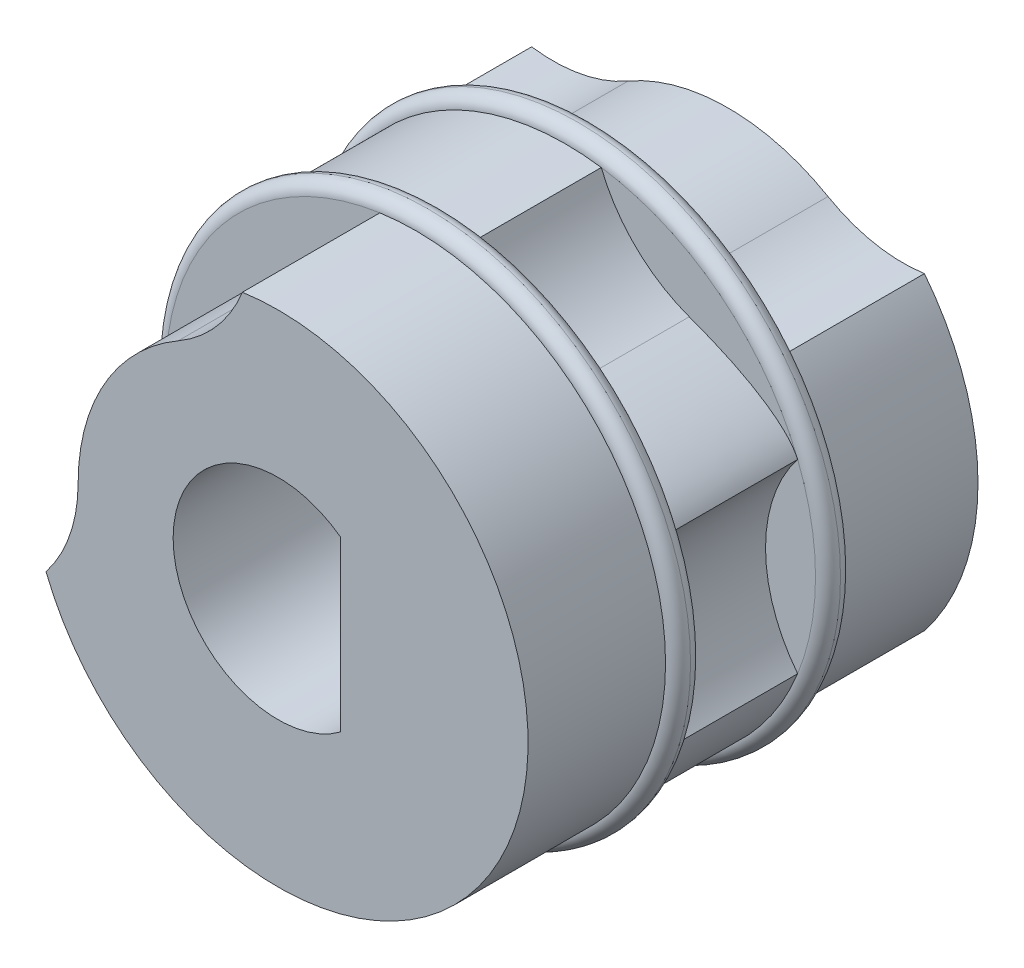
ISO-10303-21;
HEADER;
FILE_DESCRIPTION(('STEP AP214'),'2;1');
FILE_NAME('part.step','',(''),(''),'','','');
FILE_SCHEMA(('AUTOMOTIVE_DESIGN { 1 0 10303 214 1 1 1 1 }'));
ENDSEC;
DATA;
#1=APPLICATION_CONTEXT('core data for automotive mechanical design processes');
#2=APPLICATION_PROTOCOL_DEFINITION('international standard','automotive_design',2000,#1);
#3=PRODUCT_CONTEXT('',#1,'mechanical');
#4=PRODUCT('Part','Part','',(#3));
#5=PRODUCT_RELATED_PRODUCT_CATEGORY('part','',(#4));
#6=PRODUCT_DEFINITION_FORMATION('','',#4);
#7=PRODUCT_DEFINITION_CONTEXT('part definition',#1,'design');
#8=PRODUCT_DEFINITION('design','',#6,#7);
#9=PRODUCT_DEFINITION_SHAPE('','',#8);
#10=(LENGTH_UNIT() NAMED_UNIT(*) SI_UNIT(.MILLI.,.METRE.));
#11=(NAMED_UNIT(*) PLANE_ANGLE_UNIT() SI_UNIT($,.RADIAN.));
#12=(NAMED_UNIT(*) SI_UNIT($,.STERADIAN.) SOLID_ANGLE_UNIT());
#13=UNCERTAINTY_MEASURE_WITH_UNIT(LENGTH_MEASURE(1.E-05),#10,'distance_accuracy_value','');
#14=(GEOMETRIC_REPRESENTATION_CONTEXT(3) GLOBAL_UNCERTAINTY_ASSIGNED_CONTEXT((#13)) GLOBAL_UNIT_ASSIGNED_CONTEXT((#10,
#11,#12)) REPRESENTATION_CONTEXT('',''));
#15=CARTESIAN_POINT('',(0.,0.,0.));
#16=DIRECTION('',(0.,0.,1.));
#17=DIRECTION('',(1.,0.,0.));
#18=AXIS2_PLACEMENT_3D('',#15,#16,#17);
#19=CARTESIAN_POINT('',(0.,0.,11.5));
#20=DIRECTION('',(0.,0.,1.));
#21=DIRECTION('',(1.,0.,0.));
#22=AXIS2_PLACEMENT_3D('',#19,#20,#21);
#23=PLANE('',#22);
#24=CARTESIAN_POINT('',(-7.,-12.1243556529821,11.5));
#25=DIRECTION('',(0.,0.,1.));
#26=DIRECTION('',(1.,0.,0.));
#27=AXIS2_PLACEMENT_3D('',#24,#25,#26);
#28=CIRCLE('',#27,6.);
#29=CARTESIAN_POINT('',(-1.42857142857143,-9.89743318610786,11.5));
#30=VERTEX_POINT('',#29);
#31=CARTESIAN_POINT('',(-4.,-6.92820323027551,11.5));
#32=VERTEX_POINT('',#31);
#33=EDGE_CURVE('E392',#30,#32,#28,.T.);
#34=ORIENTED_EDGE('',*,*,#33,.F.);
#35=CARTESIAN_POINT('',(0.,0.,11.5));
#36=DIRECTION('',(0.,0.,1.));
#37=DIRECTION('',(1.,0.,0.));
#38=AXIS2_PLACEMENT_3D('',#35,#36,#37);
#39=CIRCLE('',#38,10.);
#40=CARTESIAN_POINT('',(-9.28571428571429,3.71153744479046,11.5));
#41=VERTEX_POINT('',#40);
#42=EDGE_CURVE('E153',#30,#41,#39,.F.);
#43=ORIENTED_EDGE('',*,*,#42,.T.);
#44=CARTESIAN_POINT('',(-14.,0.,11.5));
#45=DIRECTION('',(0.,0.,1.));
#46=DIRECTION('',(1.,0.,0.));
#47=AXIS2_PLACEMENT_3D('',#44,#45,#46);
#48=CIRCLE('',#47,6.);
#49=CARTESIAN_POINT('',(-8.,0.,11.5));
#50=VERTEX_POINT('',#49);
#51=EDGE_CURVE('E385',#50,#41,#48,.T.);
#52=ORIENTED_EDGE('',*,*,#51,.F.);
#53=CARTESIAN_POINT('',(0.,0.,11.5));
#54=DIRECTION('',(0.,0.,1.));
#55=DIRECTION('',(1.,0.,0.));
#56=AXIS2_PLACEMENT_3D('',#53,#54,#55);
#57=CIRCLE('',#56,8.);
#58=EDGE_CURVE('E473',#50,#32,#57,.T.);
#59=ORIENTED_EDGE('',*,*,#58,.T.);
#60=EDGE_LOOP('',(#34,#43,#52,#59));
#61=FACE_BOUND('',#60,.T.);
#62=ADVANCED_FACE('F97',(#61),#23,.F.);
#63=CARTESIAN_POINT('',(6.99999999999999,12.1243556529821,11.5));
#64=DIRECTION('',(0.,0.,1.));
#65=DIRECTION('',(1.,0.,0.));
#66=AXIS2_PLACEMENT_3D('',#63,#64,#65);
#67=CIRCLE('',#66,6.);
#68=CARTESIAN_POINT('',(1.42857142857142,9.89743318610788,11.5));
#69=VERTEX_POINT('',#68);
#70=CARTESIAN_POINT('',(4.94933482586439,6.4856703147506,11.5));
#71=VERTEX_POINT('',#70);
#72=EDGE_CURVE('E397',#69,#71,#67,.T.);
#73=ORIENTED_EDGE('',*,*,#72,.F.);
#74=CARTESIAN_POINT('',(0.,0.,11.5));
#75=DIRECTION('',(0.,0.,1.));
#76=DIRECTION('',(1.,0.,0.));
#77=AXIS2_PLACEMENT_3D('',#74,#75,#76);
#78=CIRCLE('',#77,10.);
#79=CARTESIAN_POINT('',(9.28571428571429,3.71153744479046,11.5));
#80=VERTEX_POINT('',#79);
#81=EDGE_CURVE('E141',#69,#80,#78,.F.);
#82=ORIENTED_EDGE('',*,*,#81,.T.);
#83=CARTESIAN_POINT('',(4.94933482586438,6.48567031475059,11.5));
#84=CARTESIAN_POINT('',(8.6441901097778,5.14193314913522,11.5));
#85=CARTESIAN_POINT('',(9.28571428571409,3.71153744479037,11.5));
#86=(BOUNDED_CURVE() B_SPLINE_CURVE(2,(#83,#84,#85),.UNSPECIFIED.,.F.,
.F.) B_SPLINE_CURVE_WITH_KNOTS((3,3),(0.,1.),
.UNSPECIFIED.) CURVE() GEOMETRIC_REPRESENTATION_ITEM() RATIONAL_B_SPLINE_CURVE((1.,
0.920985497016258,1.)) REPRESENTATION_ITEM(''));
#87=EDGE_CURVE('E111',#80,#71,#86,.F.);
#88=ORIENTED_EDGE('',*,*,#87,.T.);
#89=EDGE_LOOP('',(#73,#82,#88));
#90=FACE_BOUND('',#89,.T.);
#91=ADVANCED_FACE('F632',(#90),#23,.F.);
#92=CARTESIAN_POINT('',(0.,0.,6.5));
#93=DIRECTION('',(0.,0.,1.));
#94=DIRECTION('',(1.,0.,0.));
#95=AXIS2_PLACEMENT_3D('',#92,#93,#94);
#96=PLANE('',#95);
#97=CARTESIAN_POINT('',(6.99999999999999,12.1243556529821,6.5));
#98=DIRECTION('',(0.,0.,1.));
#99=DIRECTION('',(1.,0.,0.));
#100=AXIS2_PLACEMENT_3D('',#97,#98,#99);
#101=CIRCLE('',#100,6.);
#102=CARTESIAN_POINT('',(1.42857142857142,9.89743318610788,6.5));
#103=VERTEX_POINT('',#102);
#104=CARTESIAN_POINT('',(4.94933482586439,6.4856703147506,6.5));
#105=VERTEX_POINT('',#104);
#106=EDGE_CURVE('E407',#103,#105,#101,.T.);
#107=ORIENTED_EDGE('',*,*,#106,.T.);
#108=CARTESIAN_POINT('',(9.28571428571409,3.71153744479037,6.5));
#109=CARTESIAN_POINT('',(8.6441901097778,5.14193314913522,6.5));
#110=CARTESIAN_POINT('',(4.94933482586438,6.48567031475059,6.5));
#111=(BOUNDED_CURVE() B_SPLINE_CURVE(2,(#108,#109,#110),.UNSPECIFIED.,.F.,
.F.) B_SPLINE_CURVE_WITH_KNOTS((3,3),(0.,1.),
.UNSPECIFIED.) CURVE() GEOMETRIC_REPRESENTATION_ITEM() RATIONAL_B_SPLINE_CURVE((1.,
0.920985497016258,1.)) REPRESENTATION_ITEM(''));
#112=CARTESIAN_POINT('',(9.28571428571428,3.71153744479045,6.5));
#113=VERTEX_POINT('',#112);
#114=EDGE_CURVE('E217',#105,#113,#111,.F.);
#115=ORIENTED_EDGE('',*,*,#114,.T.);
#116=CARTESIAN_POINT('',(0.,0.,6.5));
#117=DIRECTION('',(0.,0.,1.));
#118=DIRECTION('',(1.,0.,0.));
#119=AXIS2_PLACEMENT_3D('',#116,#117,#118);
#120=CIRCLE('',#119,10.);
#121=EDGE_CURVE('E127',#113,#103,#120,.T.);
#122=ORIENTED_EDGE('',*,*,#121,.T.);
#123=EDGE_LOOP('',(#107,#115,#122));
#124=FACE_BOUND('',#123,.T.);
#125=ADVANCED_FACE('F709',(#124),#96,.T.);
#126=CARTESIAN_POINT('',(-14.,0.,6.5));
#127=DIRECTION('',(0.,0.,1.));
#128=DIRECTION('',(1.,0.,0.));
#129=AXIS2_PLACEMENT_3D('',#126,#127,#128);
#130=CIRCLE('',#129,6.);
#131=CARTESIAN_POINT('',(-8.,0.,6.5));
#132=VERTEX_POINT('',#131);
#133=CARTESIAN_POINT('',(-9.28571428571429,3.71153744479046,6.5));
#134=VERTEX_POINT('',#133);
#135=EDGE_CURVE('E505',#132,#134,#130,.T.);
#136=ORIENTED_EDGE('',*,*,#135,.T.);
#137=CARTESIAN_POINT('',(0.,0.,6.5));
#138=DIRECTION('',(0.,0.,1.));
#139=DIRECTION('',(1.,0.,0.));
#140=AXIS2_PLACEMENT_3D('',#137,#138,#139);
#141=CIRCLE('',#140,10.);
#142=CARTESIAN_POINT('',(-1.42857142857143,-9.89743318610786,6.5));
#143=VERTEX_POINT('',#142);
#144=EDGE_CURVE('E481',#134,#143,#141,.T.);
#145=ORIENTED_EDGE('',*,*,#144,.T.);
#146=CARTESIAN_POINT('',(-7.,-12.1243556529821,6.5));
#147=DIRECTION('',(0.,0.,1.));
#148=DIRECTION('',(1.,0.,0.));
#149=AXIS2_PLACEMENT_3D('',#146,#147,#148);
#150=CIRCLE('',#149,6.);
#151=CARTESIAN_POINT('',(-4.,-6.9282032302755,6.5));
#152=VERTEX_POINT('',#151);
#153=EDGE_CURVE('E513',#143,#152,#150,.T.);
#154=ORIENTED_EDGE('',*,*,#153,.T.);
#155=CARTESIAN_POINT('',(0.,0.,6.5));
#156=DIRECTION('',(0.,0.,1.));
#157=DIRECTION('',(1.,0.,0.));
#158=AXIS2_PLACEMENT_3D('',#155,#156,#157);
#159=CIRCLE('',#158,8.);
#160=EDGE_CURVE('E495',#132,#152,#159,.T.);
#161=ORIENTED_EDGE('',*,*,#160,.F.);
#162=EDGE_LOOP('',(#136,#145,#154,#161));
#163=FACE_BOUND('',#162,.T.);
#164=ADVANCED_FACE('F880',(#163),#96,.T.);
#165=CARTESIAN_POINT('',(0.,0.,5.5));
#166=DIRECTION('',(0.,0.,1.));
#167=DIRECTION('',(1.,0.,0.));
#168=AXIS2_PLACEMENT_3D('',#165,#166,#167);
#169=PLANE('',#168);
#170=CARTESIAN_POINT('',(7.,-12.1243556529821,5.5));
#171=DIRECTION('',(0.,0.,1.));
#172=DIRECTION('',(1.,0.,0.));
#173=AXIS2_PLACEMENT_3D('',#170,#171,#172);
#174=CIRCLE('',#173,6.);
#175=CARTESIAN_POINT('',(7.85714285714285,-6.18589574131742,5.5));
#176=VERTEX_POINT('',#175);
#177=CARTESIAN_POINT('',(1.42857142857144,-9.89743318610786,5.5));
#178=VERTEX_POINT('',#177);
#179=EDGE_CURVE('E372',#176,#178,#174,.T.);
#180=ORIENTED_EDGE('',*,*,#179,.F.);
#181=CARTESIAN_POINT('',(0.,0.,5.5));
#182=DIRECTION('',(0.,0.,1.));
#183=DIRECTION('',(1.,0.,0.));
#184=AXIS2_PLACEMENT_3D('',#181,#182,#183);
#185=CIRCLE('',#184,10.);
#186=EDGE_CURVE('E615',#176,#178,#185,.F.);
#187=ORIENTED_EDGE('',*,*,#186,.T.);
#188=EDGE_LOOP('',(#180,#187));
#189=FACE_BOUND('',#188,.T.);
#190=ADVANCED_FACE('F660',(#189),#169,.F.);
#191=CARTESIAN_POINT('',(-7.,-12.1243556529821,5.5));
#192=DIRECTION('',(0.,0.,1.));
#193=DIRECTION('',(1.,0.,0.));
#194=AXIS2_PLACEMENT_3D('',#191,#192,#193);
#195=CIRCLE('',#194,6.);
#196=CARTESIAN_POINT('',(-3.14208784021244,-7.52908484840889,5.5));
#197=VERTEX_POINT('',#196);
#198=CARTESIAN_POINT('',(-7.85714285714285,-6.18589574131742,5.5));
#199=VERTEX_POINT('',#198);
#200=EDGE_CURVE('E355',#197,#199,#195,.T.);
#201=ORIENTED_EDGE('',*,*,#200,.F.);
#202=CARTESIAN_POINT('',(1.42857142857141,-9.89743318610766,5.5));
#203=CARTESIAN_POINT('',(-0.130949676823513,-10.0570548047774,5.5));
#204=CARTESIAN_POINT('',(-3.14208784021243,-7.52908484840888,5.5));
#205=(BOUNDED_CURVE() B_SPLINE_CURVE(2,(#202,#203,#204),.UNSPECIFIED.,.F.,
.F.) B_SPLINE_CURVE_WITH_KNOTS((3,3),(0.,1.),
.UNSPECIFIED.) CURVE() GEOMETRIC_REPRESENTATION_ITEM() RATIONAL_B_SPLINE_CURVE((1.,
0.920985497016258,1.)) REPRESENTATION_ITEM(''));
#206=EDGE_CURVE('E13',#197,#178,#205,.F.);
#207=ORIENTED_EDGE('',*,*,#206,.T.);
#208=CARTESIAN_POINT('',(0.,0.,5.5));
#209=DIRECTION('',(0.,0.,1.));
#210=DIRECTION('',(1.,0.,0.));
#211=AXIS2_PLACEMENT_3D('',#208,#209,#210);
#212=CIRCLE('',#211,10.);
#213=EDGE_CURVE('E118',#178,#199,#212,.F.);
#214=ORIENTED_EDGE('',*,*,#213,.T.);
#215=EDGE_LOOP('',(#201,#207,#214));
#216=FACE_BOUND('',#215,.T.);
#217=ADVANCED_FACE('F661',(#216),#169,.F.);
#218=CARTESIAN_POINT('',(6.99999999999999,12.1243556529821,6.));
#219=DIRECTION('',(0.,0.,-1.));
#220=DIRECTION('',(-1.,0.,0.));
#221=AXIS2_PLACEMENT_3D('',#218,#219,#220);
#222=CYLINDRICAL_SURFACE('',#221,6.);
#223=DIRECTION('',(0.,0.,-1.));
#224=VECTOR('',#223,1.);
#225=CARTESIAN_POINT('',(3.99999999999999,6.92820323027552,6.));
#226=LINE('',#225,#224);
#227=CARTESIAN_POINT('',(3.99999999999999,6.92820323027552,5.5));
#228=VERTEX_POINT('',#227);
#229=CARTESIAN_POINT('',(3.99999999999999,6.92820323027552,0.));
#230=VERTEX_POINT('',#229);
#231=EDGE_CURVE('E459',#228,#230,#226,.T.);
#232=ORIENTED_EDGE('',*,*,#231,.F.);
#233=CARTESIAN_POINT('',(6.99999999999999,12.1243556529821,5.5));
#234=DIRECTION('',(0.,0.,1.));
#235=DIRECTION('',(1.,0.,0.));
#236=AXIS2_PLACEMENT_3D('',#233,#234,#235);
#237=CIRCLE('',#236,6.);
#238=CARTESIAN_POINT('',(7.85714285714286,6.18589574131742,5.5));
#239=VERTEX_POINT('',#238);
#240=EDGE_CURVE('E358',#228,#239,#237,.T.);
#241=ORIENTED_EDGE('',*,*,#240,.T.);
#242=DIRECTION('',(0.,0.,-1.));
#243=VECTOR('',#242,1.);
#244=CARTESIAN_POINT('',(7.85714285714286,6.18589574131742,6.));
#245=LINE('',#244,#243);
#246=CARTESIAN_POINT('',(7.85714285714286,6.18589574131742,0.));
#247=VERTEX_POINT('',#246);
#248=EDGE_CURVE('E463',#239,#247,#245,.T.);
#249=ORIENTED_EDGE('',*,*,#248,.T.);
#250=CARTESIAN_POINT('',(6.99999999999999,12.1243556529821,0.));
#251=DIRECTION('',(0.,0.,1.));
#252=DIRECTION('',(1.,0.,0.));
#253=AXIS2_PLACEMENT_3D('',#250,#251,#252);
#254=CIRCLE('',#253,6.);
#255=EDGE_CURVE('E600',#230,#247,#254,.T.);
#256=ORIENTED_EDGE('',*,*,#255,.F.);
#257=EDGE_LOOP('',(#232,#241,#249,#256));
#258=FACE_BOUND('',#257,.T.);
#259=ADVANCED_FACE('F826',(#258),#222,.F.);
#260=CARTESIAN_POINT('',(-7.,-12.1243556529821,6.));
#261=DIRECTION('',(0.,0.,-1.));
#262=DIRECTION('',(-1.,0.,0.));
#263=AXIS2_PLACEMENT_3D('',#260,#261,#262);
#264=CYLINDRICAL_SURFACE('',#263,6.);
#265=CARTESIAN_POINT('',(-7.,-12.1243556529821,0.));
#266=DIRECTION('',(0.,0.,1.));
#267=DIRECTION('',(1.,0.,0.));
#268=AXIS2_PLACEMENT_3D('',#265,#266,#267);
#269=CIRCLE('',#268,6.);
#270=CARTESIAN_POINT('',(-3.14208784021244,-7.52908484840889,0.));
#271=VERTEX_POINT('',#270);
#272=CARTESIAN_POINT('',(-7.85714285714285,-6.18589574131742,0.));
#273=VERTEX_POINT('',#272);
#274=EDGE_CURVE('E186',#271,#273,#269,.T.);
#275=ORIENTED_EDGE('',*,*,#274,.F.);
#276=CARTESIAN_POINT('',(-3.14208784021243,-7.52908484840888,5.775));
#277=CARTESIAN_POINT('',(-3.14208784021243,-7.52908484840888,3.75833333333333));
#278=CARTESIAN_POINT('',(-3.14208784021243,-7.52908484840888,1.74166666666667));
#279=CARTESIAN_POINT('',(-3.14208784021243,-7.52908484840888,-0.275));
#280=(BOUNDED_CURVE() B_SPLINE_CURVE(3,(#276,#277,#278,#279),.UNSPECIFIED.,.F.,
.F.) B_SPLINE_CURVE_WITH_KNOTS((4,4),(-0.006275,-0.000225),
.UNSPECIFIED.) CURVE() GEOMETRIC_REPRESENTATION_ITEM() RATIONAL_B_SPLINE_CURVE((1.,1.,1.,1.)) REPRESENTATION_ITEM(''));
#281=EDGE_CURVE('E198',#271,#197,#280,.F.);
#282=ORIENTED_EDGE('',*,*,#281,.T.);
#283=ORIENTED_EDGE('',*,*,#200,.T.);
#284=DIRECTION('',(0.,0.,-1.));
#285=VECTOR('',#284,1.);
#286=CARTESIAN_POINT('',(-7.85714285714285,-6.18589574131742,6.));
#287=LINE('',#286,#285);
#288=EDGE_CURVE('E208',#199,#273,#287,.T.);
#289=ORIENTED_EDGE('',*,*,#288,.T.);
#290=EDGE_LOOP('',(#275,#282,#283,#289));
#291=FACE_BOUND('',#290,.T.);
#292=ADVANCED_FACE('F203',(#291),#264,.F.);
#293=CARTESIAN_POINT('',(0.,0.,6.));
#294=DIRECTION('',(0.,0.,-1.));
#295=DIRECTION('',(-1.,0.,0.));
#296=AXIS2_PLACEMENT_3D('',#293,#294,#295);
#297=CYLINDRICAL_SURFACE('',#296,10.);
#298=CARTESIAN_POINT('',(0.,0.,5.5));
#299=DIRECTION('',(0.,0.,1.));
#300=DIRECTION('',(1.,0.,0.));
#301=AXIS2_PLACEMENT_3D('',#298,#299,#300);
#302=CIRCLE('',#301,10.);
#303=EDGE_CURVE('E368',#176,#239,#302,.T.);
#304=ORIENTED_EDGE('',*,*,#303,.F.);
#305=DIRECTION('',(0.,0.,-1.));
#306=VECTOR('',#305,1.);
#307=CARTESIAN_POINT('',(7.85714285714285,-6.18589574131742,6.));
#308=LINE('',#307,#306);
#309=CARTESIAN_POINT('',(7.85714285714285,-6.18589574131742,0.));
#310=VERTEX_POINT('',#309);
#311=EDGE_CURVE('E440',#176,#310,#308,.T.);
#312=ORIENTED_EDGE('',*,*,#311,.T.);
#313=CARTESIAN_POINT('',(0.,0.,0.));
#314=DIRECTION('',(0.,0.,1.));
#315=DIRECTION('',(1.,0.,0.));
#316=AXIS2_PLACEMENT_3D('',#313,#314,#315);
#317=CIRCLE('',#316,10.);
#318=EDGE_CURVE('E352',#310,#247,#317,.T.);
#319=ORIENTED_EDGE('',*,*,#318,.T.);
#320=ORIENTED_EDGE('',*,*,#248,.F.);
#321=EDGE_LOOP('',(#304,#312,#319,#320));
#322=FACE_BOUND('',#321,.T.);
#323=ADVANCED_FACE('F782',(#322),#297,.T.);
#324=CARTESIAN_POINT('',(0.,0.,5.5));
#325=DIRECTION('',(0.,0.,1.));
#326=DIRECTION('',(1.,0.,0.));
#327=AXIS2_PLACEMENT_3D('',#324,#325,#326);
#328=CIRCLE('',#327,10.);
#329=CARTESIAN_POINT('',(-7.85714285714287,6.18589574131742,5.5));
#330=VERTEX_POINT('',#329);
#331=EDGE_CURVE('E359',#330,#199,#328,.T.);
#332=ORIENTED_EDGE('',*,*,#331,.F.);
#333=DIRECTION('',(0.,0.,-1.));
#334=VECTOR('',#333,1.);
#335=CARTESIAN_POINT('',(-7.85714285714287,6.18589574131741,6.));
#336=LINE('',#335,#334);
#337=CARTESIAN_POINT('',(-7.85714285714287,6.18589574131741,0.));
#338=VERTEX_POINT('',#337);
#339=EDGE_CURVE('E451',#330,#338,#336,.T.);
#340=ORIENTED_EDGE('',*,*,#339,.T.);
#341=CARTESIAN_POINT('',(0.,0.,0.));
#342=DIRECTION('',(0.,0.,1.));
#343=DIRECTION('',(1.,0.,0.));
#344=AXIS2_PLACEMENT_3D('',#341,#342,#343);
#345=CIRCLE('',#344,10.);
#346=EDGE_CURVE('E212',#338,#273,#345,.T.);
#347=ORIENTED_EDGE('',*,*,#346,.T.);
#348=ORIENTED_EDGE('',*,*,#288,.F.);
#349=EDGE_LOOP('',(#332,#340,#347,#348));
#350=FACE_BOUND('',#349,.T.);
#351=ADVANCED_FACE('F249',(#350),#297,.T.);
#352=CARTESIAN_POINT('',(7.,-12.1243556529821,6.));
#353=DIRECTION('',(0.,0.,-1.));
#354=DIRECTION('',(-1.,0.,0.));
#355=AXIS2_PLACEMENT_3D('',#352,#353,#354);
#356=CYLINDRICAL_SURFACE('',#355,6.);
#357=ORIENTED_EDGE('',*,*,#311,.F.);
#358=ORIENTED_EDGE('',*,*,#179,.T.);
#359=CARTESIAN_POINT('',(1.42857142857141,-9.89743318610766,-0.275));
#360=CARTESIAN_POINT('',(1.42857142857141,-9.89743318610766,1.74166666666667));
#361=CARTESIAN_POINT('',(1.42857142857141,-9.89743318610766,3.75833333333333));
#362=CARTESIAN_POINT('',(1.42857142857141,-9.89743318610766,5.775));
#363=(BOUNDED_CURVE() B_SPLINE_CURVE(3,(#359,#360,#361,#362),.UNSPECIFIED.,.F.,
.F.) B_SPLINE_CURVE_WITH_KNOTS((4,4),(-0.006275,-0.000225),
.UNSPECIFIED.) CURVE() GEOMETRIC_REPRESENTATION_ITEM() RATIONAL_B_SPLINE_CURVE((1.,1.,1.,1.)) REPRESENTATION_ITEM(''));
#364=CARTESIAN_POINT('',(1.42857142857144,-9.89743318610786,0.));
#365=VERTEX_POINT('',#364);
#366=EDGE_CURVE('E232',#178,#365,#363,.F.);
#367=ORIENTED_EDGE('',*,*,#366,.T.);
#368=CARTESIAN_POINT('',(7.,-12.1243556529821,0.));
#369=DIRECTION('',(0.,0.,1.));
#370=DIRECTION('',(1.,0.,0.));
#371=AXIS2_PLACEMENT_3D('',#368,#369,#370);
#372=CIRCLE('',#371,6.);
#373=EDGE_CURVE('E191',#310,#365,#372,.T.);
#374=ORIENTED_EDGE('',*,*,#373,.F.);
#375=EDGE_LOOP('',(#357,#358,#367,#374));
#376=FACE_BOUND('',#375,.T.);
#377=ADVANCED_FACE('F238',(#376),#356,.F.);
#378=CARTESIAN_POINT('',(0.,0.,6.));
#379=DIRECTION('',(0.,0.,-1.));
#380=DIRECTION('',(-1.,0.,0.));
#381=AXIS2_PLACEMENT_3D('',#378,#379,#380);
#382=CYLINDRICAL_SURFACE('',#381,8.);
#383=CARTESIAN_POINT('',(0.,0.,5.5));
#384=DIRECTION('',(0.,0.,1.));
#385=DIRECTION('',(1.,0.,0.));
#386=AXIS2_PLACEMENT_3D('',#383,#384,#385);
#387=CIRCLE('',#386,8.);
#388=CARTESIAN_POINT('',(-4.00000000000001,6.92820323027551,5.5));
#389=VERTEX_POINT('',#388);
#390=EDGE_CURVE('E529',#228,#389,#387,.T.);
#391=ORIENTED_EDGE('',*,*,#390,.F.);
#392=ORIENTED_EDGE('',*,*,#231,.T.);
#393=CARTESIAN_POINT('',(0.,0.,0.));
#394=DIRECTION('',(0.,0.,1.));
#395=DIRECTION('',(1.,0.,0.));
#396=AXIS2_PLACEMENT_3D('',#393,#394,#395);
#397=CIRCLE('',#396,8.);
#398=CARTESIAN_POINT('',(-4.00000000000001,6.92820323027551,0.));
#399=VERTEX_POINT('',#398);
#400=EDGE_CURVE('E604',#230,#399,#397,.T.);
#401=ORIENTED_EDGE('',*,*,#400,.T.);
#402=DIRECTION('',(0.,0.,-1.));
#403=VECTOR('',#402,1.);
#404=CARTESIAN_POINT('',(-4.00000000000001,6.92820323027551,6.));
#405=LINE('',#404,#403);
#406=EDGE_CURVE('E455',#389,#399,#405,.T.);
#407=ORIENTED_EDGE('',*,*,#406,.F.);
#408=EDGE_LOOP('',(#391,#392,#401,#407));
#409=FACE_BOUND('',#408,.T.);
#410=ADVANCED_FACE('F248',(#409),#382,.T.);
#411=CARTESIAN_POINT('',(-7.00000000000001,12.1243556529821,6.));
#412=DIRECTION('',(0.,0.,-1.));
#413=DIRECTION('',(-1.,0.,0.));
#414=AXIS2_PLACEMENT_3D('',#411,#412,#413);
#415=CYLINDRICAL_SURFACE('',#414,6.);
#416=ORIENTED_EDGE('',*,*,#339,.F.);
#417=CARTESIAN_POINT('',(-7.00000000000001,12.1243556529821,5.5));
#418=DIRECTION('',(0.,0.,1.));
#419=DIRECTION('',(1.,0.,0.));
#420=AXIS2_PLACEMENT_3D('',#417,#418,#419);
#421=CIRCLE('',#420,6.);
#422=EDGE_CURVE('E525',#330,#389,#421,.T.);
#423=ORIENTED_EDGE('',*,*,#422,.T.);
#424=ORIENTED_EDGE('',*,*,#406,.T.);
#425=CARTESIAN_POINT('',(-7.00000000000001,12.1243556529821,0.));
#426=DIRECTION('',(0.,0.,1.));
#427=DIRECTION('',(1.,0.,0.));
#428=AXIS2_PLACEMENT_3D('',#425,#426,#427);
#429=CIRCLE('',#428,6.);
#430=EDGE_CURVE('E608',#338,#399,#429,.T.);
#431=ORIENTED_EDGE('',*,*,#430,.F.);
#432=EDGE_LOOP('',(#416,#423,#424,#431));
#433=FACE_BOUND('',#432,.T.);
#434=ADVANCED_FACE('F788',(#433),#415,.F.);
#435=ORIENTED_EDGE('',*,*,#72,.T.);
#436=CARTESIAN_POINT('',(4.94933482586438,6.48567031475059,6.25));
#437=CARTESIAN_POINT('',(4.94933482586438,6.48567031475059,8.08333333333333));
#438=CARTESIAN_POINT('',(4.94933482586438,6.48567031475059,9.91666666666667));
#439=CARTESIAN_POINT('',(4.94933482586438,6.48567031475059,11.75));
#440=(BOUNDED_CURVE() B_SPLINE_CURVE(3,(#436,#437,#438,#439),.UNSPECIFIED.,.F.,
.F.) B_SPLINE_CURVE_WITH_KNOTS((4,4),(0.00025,0.00575),
.UNSPECIFIED.) CURVE() GEOMETRIC_REPRESENTATION_ITEM() RATIONAL_B_SPLINE_CURVE((1.,1.,1.,1.)) REPRESENTATION_ITEM(''));
#441=EDGE_CURVE('E199',#71,#105,#440,.F.);
#442=ORIENTED_EDGE('',*,*,#441,.T.);
#443=ORIENTED_EDGE('',*,*,#106,.F.);
#444=DIRECTION('',(0.,0.,-1.));
#445=VECTOR('',#444,1.);
#446=CARTESIAN_POINT('',(1.42857142857142,9.89743318610788,12.));
#447=LINE('',#446,#445);
#448=EDGE_CURVE('E592',#69,#103,#447,.T.);
#449=ORIENTED_EDGE('',*,*,#448,.F.);
#450=EDGE_LOOP('',(#435,#442,#443,#449));
#451=FACE_BOUND('',#450,.T.);
#452=ADVANCED_FACE('F250',(#451),#222,.F.);
#453=ORIENTED_EDGE('',*,*,#153,.F.);
#454=DIRECTION('',(0.,0.,-1.));
#455=VECTOR('',#454,1.);
#456=CARTESIAN_POINT('',(-1.42857142857143,-9.89743318610786,6.));
#457=LINE('',#456,#455);
#458=EDGE_CURVE('E445',#30,#143,#457,.T.);
#459=ORIENTED_EDGE('',*,*,#458,.F.);
#460=ORIENTED_EDGE('',*,*,#33,.T.);
#461=DIRECTION('',(0.,0.,-1.));
#462=VECTOR('',#461,1.);
#463=CARTESIAN_POINT('',(-4.,-6.9282032302755,12.));
#464=LINE('',#463,#462);
#465=EDGE_CURVE('E580',#32,#152,#464,.T.);
#466=ORIENTED_EDGE('',*,*,#465,.T.);
#467=EDGE_LOOP('',(#453,#459,#460,#466));
#468=FACE_BOUND('',#467,.T.);
#469=ADVANCED_FACE('F714',(#468),#264,.F.);
#470=ORIENTED_EDGE('',*,*,#458,.T.);
#471=CARTESIAN_POINT('',(0.,0.,6.5));
#472=DIRECTION('',(0.,0.,1.));
#473=DIRECTION('',(1.,0.,0.));
#474=AXIS2_PLACEMENT_3D('',#471,#472,#473);
#475=CIRCLE('',#474,10.);
#476=CARTESIAN_POINT('',(9.28571428571428,-3.71153744479045,6.5));
#477=VERTEX_POINT('',#476);
#478=EDGE_CURVE('E518',#143,#477,#475,.T.);
#479=ORIENTED_EDGE('',*,*,#478,.T.);
#480=DIRECTION('',(0.,0.,-1.));
#481=VECTOR('',#480,1.);
#482=CARTESIAN_POINT('',(9.28571428571428,-3.71153744479045,12.));
#483=LINE('',#482,#481);
#484=CARTESIAN_POINT('',(9.28571428571428,-3.71153744479045,11.5));
#485=VERTEX_POINT('',#484);
#486=EDGE_CURVE('E576',#485,#477,#483,.T.);
#487=ORIENTED_EDGE('',*,*,#486,.F.);
#488=CARTESIAN_POINT('',(0.,0.,11.5));
#489=DIRECTION('',(0.,0.,1.));
#490=DIRECTION('',(1.,0.,0.));
#491=AXIS2_PLACEMENT_3D('',#488,#489,#490);
#492=CIRCLE('',#491,10.);
#493=EDGE_CURVE('E393',#30,#485,#492,.T.);
#494=ORIENTED_EDGE('',*,*,#493,.F.);
#495=EDGE_LOOP('',(#470,#479,#487,#494));
#496=FACE_BOUND('',#495,.T.);
#497=ADVANCED_FACE('F787',(#496),#297,.T.);
#498=ORIENTED_EDGE('',*,*,#448,.T.);
#499=CARTESIAN_POINT('',(0.,0.,6.5));
#500=DIRECTION('',(0.,0.,1.));
#501=DIRECTION('',(1.,0.,0.));
#502=AXIS2_PLACEMENT_3D('',#499,#500,#501);
#503=CIRCLE('',#502,10.);
#504=EDGE_CURVE('E509',#103,#134,#503,.T.);
#505=ORIENTED_EDGE('',*,*,#504,.T.);
#506=DIRECTION('',(0.,0.,-1.));
#507=VECTOR('',#506,1.);
#508=CARTESIAN_POINT('',(-9.28571428571429,3.71153744479046,12.));
#509=LINE('',#508,#507);
#510=EDGE_CURVE('E588',#41,#134,#509,.T.);
#511=ORIENTED_EDGE('',*,*,#510,.F.);
#512=EDGE_CURVE('E388',#69,#41,#492,.T.);
#513=ORIENTED_EDGE('',*,*,#512,.F.);
#514=EDGE_LOOP('',(#498,#505,#511,#513));
#515=FACE_BOUND('',#514,.T.);
#516=ADVANCED_FACE('F333',(#515),#297,.T.);
#517=CARTESIAN_POINT('',(14.,0.,12.));
#518=DIRECTION('',(0.,0.,-1.));
#519=DIRECTION('',(-1.,0.,0.));
#520=AXIS2_PLACEMENT_3D('',#517,#518,#519);
#521=CYLINDRICAL_SURFACE('',#520,6.);
#522=CARTESIAN_POINT('',(14.,0.,6.5));
#523=DIRECTION('',(0.,0.,1.));
#524=DIRECTION('',(1.,0.,0.));
#525=AXIS2_PLACEMENT_3D('',#522,#523,#524);
#526=CIRCLE('',#525,6.);
#527=EDGE_CURVE('E521',#113,#477,#526,.T.);
#528=ORIENTED_EDGE('',*,*,#527,.F.);
#529=CARTESIAN_POINT('',(9.28571428571409,3.71153744479037,11.75));
#530=CARTESIAN_POINT('',(9.28571428571409,3.71153744479037,9.91666666666667));
#531=CARTESIAN_POINT('',(9.28571428571409,3.71153744479037,8.08333333333333));
#532=CARTESIAN_POINT('',(9.28571428571409,3.71153744479037,6.25));
#533=(BOUNDED_CURVE() B_SPLINE_CURVE(3,(#529,#530,#531,#532),.UNSPECIFIED.,.F.,
.F.) B_SPLINE_CURVE_WITH_KNOTS((4,4),(0.00025,0.00575),
.UNSPECIFIED.) CURVE() GEOMETRIC_REPRESENTATION_ITEM() RATIONAL_B_SPLINE_CURVE((1.,1.,1.,1.)) REPRESENTATION_ITEM(''));
#534=EDGE_CURVE('E305',#80,#113,#533,.T.);
#535=ORIENTED_EDGE('',*,*,#534,.F.);
#536=CARTESIAN_POINT('',(14.,0.,11.5));
#537=DIRECTION('',(0.,0.,1.));
#538=DIRECTION('',(1.,0.,0.));
#539=AXIS2_PLACEMENT_3D('',#536,#537,#538);
#540=CIRCLE('',#539,6.);
#541=EDGE_CURVE('E537',#80,#485,#540,.T.);
#542=ORIENTED_EDGE('',*,*,#541,.T.);
#543=ORIENTED_EDGE('',*,*,#486,.T.);
#544=EDGE_LOOP('',(#528,#535,#542,#543));
#545=FACE_BOUND('',#544,.T.);
#546=ADVANCED_FACE('F322',(#545),#521,.F.);
#547=CARTESIAN_POINT('',(-14.,0.,12.));
#548=DIRECTION('',(0.,0.,-1.));
#549=DIRECTION('',(-1.,0.,0.));
#550=AXIS2_PLACEMENT_3D('',#547,#548,#549);
#551=CYLINDRICAL_SURFACE('',#550,6.);
#552=ORIENTED_EDGE('',*,*,#135,.F.);
#553=DIRECTION('',(0.,0.,-1.));
#554=VECTOR('',#553,1.);
#555=CARTESIAN_POINT('',(-8.,0.,12.));
#556=LINE('',#555,#554);
#557=EDGE_CURVE('E584',#50,#132,#556,.T.);
#558=ORIENTED_EDGE('',*,*,#557,.F.);
#559=ORIENTED_EDGE('',*,*,#51,.T.);
#560=ORIENTED_EDGE('',*,*,#510,.T.);
#561=EDGE_LOOP('',(#552,#558,#559,#560));
#562=FACE_BOUND('',#561,.T.);
#563=ADVANCED_FACE('F332',(#562),#551,.F.);
#564=CARTESIAN_POINT('',(0.,0.,12.));
#565=DIRECTION('',(0.,0.,-1.));
#566=DIRECTION('',(-1.,0.,0.));
#567=AXIS2_PLACEMENT_3D('',#564,#565,#566);
#568=CYLINDRICAL_SURFACE('',#567,8.);
#569=ORIENTED_EDGE('',*,*,#557,.T.);
#570=ORIENTED_EDGE('',*,*,#160,.T.);
#571=ORIENTED_EDGE('',*,*,#465,.F.);
#572=ORIENTED_EDGE('',*,*,#58,.F.);
#573=EDGE_LOOP('',(#569,#570,#571,#572));
#574=FACE_BOUND('',#573,.T.);
#575=ADVANCED_FACE('F334',(#574),#568,.T.);
#576=CARTESIAN_POINT('',(0.,0.,6.));
#577=DIRECTION('',(0.,0.,-1.));
#578=DIRECTION('',(-1.,0.,0.));
#579=AXIS2_PLACEMENT_3D('',#576,#577,#578);
#580=CYLINDRICAL_SURFACE('',#579,4.2);
#581=DIRECTION('',(0.,0.,-1.));
#582=VECTOR('',#581,1.);
#583=CARTESIAN_POINT('',(2.5,-3.37490740613723,6.));
#584=LINE('',#583,#582);
#585=CARTESIAN_POINT('',(2.5,-3.37490740613723,18.));
#586=VERTEX_POINT('',#585);
#587=CARTESIAN_POINT('',(2.5,-3.37490740613723,0.));
#588=VERTEX_POINT('',#587);
#589=EDGE_CURVE('E435',#586,#588,#584,.T.);
#590=ORIENTED_EDGE('',*,*,#589,.T.);
#591=CARTESIAN_POINT('',(0.,0.,0.));
#592=DIRECTION('',(0.,0.,1.));
#593=DIRECTION('',(1.,0.,0.));
#594=AXIS2_PLACEMENT_3D('',#591,#592,#593);
#595=CIRCLE('',#594,4.2);
#596=CARTESIAN_POINT('',(2.5,3.37490740613723,0.));
#597=VERTEX_POINT('',#596);
#598=EDGE_CURVE('E211',#597,#588,#595,.T.);
#599=ORIENTED_EDGE('',*,*,#598,.F.);
#600=DIRECTION('',(0.,0.,-1.));
#601=VECTOR('',#600,1.);
#602=CARTESIAN_POINT('',(2.5,3.37490740613723,6.));
#603=LINE('',#602,#601);
#604=CARTESIAN_POINT('',(2.5,3.37490740613724,18.));
#605=VERTEX_POINT('',#604);
#606=EDGE_CURVE('E439',#605,#597,#603,.T.);
#607=ORIENTED_EDGE('',*,*,#606,.F.);
#608=CARTESIAN_POINT('',(0.,0.,18.));
#609=DIRECTION('',(0.,0.,1.));
#610=DIRECTION('',(1.,0.,0.));
#611=AXIS2_PLACEMENT_3D('',#608,#609,#610);
#612=CIRCLE('',#611,4.2);
#613=EDGE_CURVE('E400',#605,#586,#612,.T.);
#614=ORIENTED_EDGE('',*,*,#613,.T.);
#615=EDGE_LOOP('',(#590,#599,#607,#614));
#616=FACE_BOUND('',#615,.T.);
#617=ADVANCED_FACE('F701',(#616),#580,.F.);
#618=DIRECTION('',(0.,0.,-1.));
#619=VECTOR('',#618,1.);
#620=CARTESIAN_POINT('',(-9.28571428571429,-3.71153744479045,18.));
#621=LINE('',#620,#619);
#622=CARTESIAN_POINT('',(-9.28571428571429,-3.71153744479045,18.));
#623=VERTEX_POINT('',#622);
#624=CARTESIAN_POINT('',(-9.28571428571429,-3.71153744479045,12.5));
#625=VERTEX_POINT('',#624);
#626=EDGE_CURVE('E564',#623,#625,#621,.T.);
#627=ORIENTED_EDGE('',*,*,#626,.T.);
#628=CARTESIAN_POINT('',(0.,0.,12.5));
#629=DIRECTION('',(0.,0.,1.));
#630=DIRECTION('',(1.,0.,0.));
#631=AXIS2_PLACEMENT_3D('',#628,#629,#630);
#632=CIRCLE('',#631,10.);
#633=CARTESIAN_POINT('',(-1.42857142857144,9.89743318610788,12.5));
#634=VERTEX_POINT('',#633);
#635=EDGE_CURVE('E381',#625,#634,#632,.T.);
#636=ORIENTED_EDGE('',*,*,#635,.T.);
#637=DIRECTION('',(0.,0.,-1.));
#638=VECTOR('',#637,1.);
#639=CARTESIAN_POINT('',(-1.42857142857144,9.89743318610788,18.));
#640=LINE('',#639,#638);
#641=CARTESIAN_POINT('',(-1.42857142857144,9.89743318610788,18.));
#642=VERTEX_POINT('',#641);
#643=EDGE_CURVE('E560',#642,#634,#640,.T.);
#644=ORIENTED_EDGE('',*,*,#643,.F.);
#645=CARTESIAN_POINT('',(0.,0.,18.));
#646=DIRECTION('',(0.,0.,1.));
#647=DIRECTION('',(1.,0.,0.));
#648=AXIS2_PLACEMENT_3D('',#645,#646,#647);
#649=CIRCLE('',#648,10.);
#650=EDGE_CURVE('E548',#623,#642,#649,.T.);
#651=ORIENTED_EDGE('',*,*,#650,.F.);
#652=EDGE_LOOP('',(#627,#636,#644,#651));
#653=FACE_BOUND('',#652,.T.);
#654=ADVANCED_FACE('F761',(#653),#297,.T.);
#655=CARTESIAN_POINT('',(2.5,0.,6.));
#656=DIRECTION('',(1.,0.,0.));
#657=DIRECTION('',(0.,0.,-1.));
#658=AXIS2_PLACEMENT_3D('',#655,#656,#657);
#659=PLANE('',#658);
#660=DIRECTION('',(0.,-1.,0.));
#661=VECTOR('',#660,1.);
#662=CARTESIAN_POINT('',(2.5,0.,0.));
#663=LINE('',#662,#661);
#664=EDGE_CURVE('E431',#597,#588,#663,.T.);
#665=ORIENTED_EDGE('',*,*,#664,.T.);
#666=ORIENTED_EDGE('',*,*,#589,.F.);
#667=DIRECTION('',(0.,1.,0.));
#668=VECTOR('',#667,1.);
#669=CARTESIAN_POINT('',(2.5,0.,18.));
#670=LINE('',#669,#668);
#671=EDGE_CURVE('E542',#586,#605,#670,.T.);
#672=ORIENTED_EDGE('',*,*,#671,.T.);
#673=ORIENTED_EDGE('',*,*,#606,.T.);
#674=EDGE_LOOP('',(#665,#666,#672,#673));
#675=FACE_BOUND('',#674,.T.);
#676=ADVANCED_FACE('F340',(#675),#659,.F.);
#677=CARTESIAN_POINT('',(0.,0.,0.));
#678=DIRECTION('',(0.,0.,1.));
#679=DIRECTION('',(1.,0.,0.));
#680=AXIS2_PLACEMENT_3D('',#677,#678,#679);
#681=PLANE('',#680);
#682=ORIENTED_EDGE('',*,*,#373,.T.);
#683=CARTESIAN_POINT('',(-3.14208784021243,-7.52908484840888,0.));
#684=CARTESIAN_POINT('',(-0.130949676823513,-10.0570548047774,0.));
#685=CARTESIAN_POINT('',(1.42857142857142,-9.89743318610766,0.));
#686=(BOUNDED_CURVE() B_SPLINE_CURVE(2,(#683,#684,#685),.UNSPECIFIED.,.F.,
.F.) B_SPLINE_CURVE_WITH_KNOTS((3,3),(0.,1.),
.UNSPECIFIED.) CURVE() GEOMETRIC_REPRESENTATION_ITEM() RATIONAL_B_SPLINE_CURVE((1.,
0.920985497016258,1.)) REPRESENTATION_ITEM(''));
#687=EDGE_CURVE('E179',#365,#271,#686,.F.);
#688=ORIENTED_EDGE('',*,*,#687,.T.);
#689=ORIENTED_EDGE('',*,*,#274,.T.);
#690=ORIENTED_EDGE('',*,*,#346,.F.);
#691=ORIENTED_EDGE('',*,*,#430,.T.);
#692=ORIENTED_EDGE('',*,*,#400,.F.);
#693=ORIENTED_EDGE('',*,*,#255,.T.);
#694=ORIENTED_EDGE('',*,*,#318,.F.);
#695=EDGE_LOOP('',(#682,#688,#689,#690,#691,#692,#693,#694));
#696=FACE_BOUND('',#695,.T.);
#697=ORIENTED_EDGE('',*,*,#598,.T.);
#698=ORIENTED_EDGE('',*,*,#664,.F.);
#699=EDGE_LOOP('',(#697,#698));
#700=FACE_BOUND('',#699,.T.);
#701=ADVANCED_FACE('F182',(#696,#700),#681,.F.);
#702=CARTESIAN_POINT('',(-3.5,6.06217782649107,18.));
#703=DIRECTION('',(0.,0.,1.));
#704=DIRECTION('',(1.,0.,0.));
#705=AXIS2_PLACEMENT_3D('',#702,#703,#704);
#706=PLANE('',#705);
#707=CARTESIAN_POINT('',(-7.00000000000001,12.1243556529821,18.));
#708=DIRECTION('',(0.,0.,1.));
#709=DIRECTION('',(1.,0.,0.));
#710=AXIS2_PLACEMENT_3D('',#707,#708,#709);
#711=CIRCLE('',#710,6.);
#712=CARTESIAN_POINT('',(-4.00000000000001,6.92820323027551,18.));
#713=VERTEX_POINT('',#712);
#714=EDGE_CURVE('E545',#713,#642,#711,.T.);
#715=ORIENTED_EDGE('',*,*,#714,.F.);
#716=CARTESIAN_POINT('',(0.,0.,18.));
#717=DIRECTION('',(0.,0.,1.));
#718=DIRECTION('',(1.,0.,0.));
#719=AXIS2_PLACEMENT_3D('',#716,#717,#718);
#720=CIRCLE('',#719,8.);
#721=CARTESIAN_POINT('',(-8.,0.,18.));
#722=VERTEX_POINT('',#721);
#723=EDGE_CURVE('E556',#713,#722,#720,.T.);
#724=ORIENTED_EDGE('',*,*,#723,.T.);
#725=CARTESIAN_POINT('',(-14.,0.,18.));
#726=DIRECTION('',(0.,0.,1.));
#727=DIRECTION('',(1.,0.,0.));
#728=AXIS2_PLACEMENT_3D('',#725,#726,#727);
#729=CIRCLE('',#728,6.);
#730=EDGE_CURVE('E552',#623,#722,#729,.T.);
#731=ORIENTED_EDGE('',*,*,#730,.F.);
#732=ORIENTED_EDGE('',*,*,#650,.T.);
#733=EDGE_LOOP('',(#715,#724,#731,#732));
#734=FACE_BOUND('',#733,.T.);
#735=ORIENTED_EDGE('',*,*,#671,.F.);
#736=ORIENTED_EDGE('',*,*,#613,.F.);
#737=EDGE_LOOP('',(#735,#736));
#738=FACE_BOUND('',#737,.T.);
#739=ADVANCED_FACE('F339',(#734,#738),#706,.T.);
#740=CARTESIAN_POINT('',(-7.00000000000001,12.1243556529821,18.));
#741=DIRECTION('',(0.,0.,-1.));
#742=DIRECTION('',(-1.,0.,0.));
#743=AXIS2_PLACEMENT_3D('',#740,#741,#742);
#744=CYLINDRICAL_SURFACE('',#743,6.);
#745=CARTESIAN_POINT('',(-7.00000000000001,12.1243556529821,12.5));
#746=DIRECTION('',(0.,0.,1.));
#747=DIRECTION('',(1.,0.,0.));
#748=AXIS2_PLACEMENT_3D('',#745,#746,#747);
#749=CIRCLE('',#748,6.);
#750=CARTESIAN_POINT('',(-4.00000000000001,6.92820323027551,12.5));
#751=VERTEX_POINT('',#750);
#752=EDGE_CURVE('E377',#751,#634,#749,.T.);
#753=ORIENTED_EDGE('',*,*,#752,.F.);
#754=DIRECTION('',(0.,0.,-1.));
#755=VECTOR('',#754,1.);
#756=CARTESIAN_POINT('',(-4.00000000000001,6.92820323027551,18.));
#757=LINE('',#756,#755);
#758=EDGE_CURVE('E572',#713,#751,#757,.T.);
#759=ORIENTED_EDGE('',*,*,#758,.F.);
#760=ORIENTED_EDGE('',*,*,#714,.T.);
#761=ORIENTED_EDGE('',*,*,#643,.T.);
#762=EDGE_LOOP('',(#753,#759,#760,#761));
#763=FACE_BOUND('',#762,.T.);
#764=ADVANCED_FACE('F684',(#763),#744,.F.);
#765=CARTESIAN_POINT('',(0.,0.,18.));
#766=DIRECTION('',(0.,0.,-1.));
#767=DIRECTION('',(-1.,0.,0.));
#768=AXIS2_PLACEMENT_3D('',#765,#766,#767);
#769=CYLINDRICAL_SURFACE('',#768,8.);
#770=ORIENTED_EDGE('',*,*,#758,.T.);
#771=CARTESIAN_POINT('',(0.,0.,12.5));
#772=DIRECTION('',(0.,0.,1.));
#773=DIRECTION('',(1.,0.,0.));
#774=AXIS2_PLACEMENT_3D('',#771,#772,#773);
#775=CIRCLE('',#774,8.);
#776=CARTESIAN_POINT('',(-8.,0.,12.5));
#777=VERTEX_POINT('',#776);
#778=EDGE_CURVE('E373',#751,#777,#775,.T.);
#779=ORIENTED_EDGE('',*,*,#778,.T.);
#780=DIRECTION('',(0.,0.,-1.));
#781=VECTOR('',#780,1.);
#782=CARTESIAN_POINT('',(-8.,0.,18.));
#783=LINE('',#782,#781);
#784=EDGE_CURVE('E568',#722,#777,#783,.T.);
#785=ORIENTED_EDGE('',*,*,#784,.F.);
#786=ORIENTED_EDGE('',*,*,#723,.F.);
#787=EDGE_LOOP('',(#770,#779,#785,#786));
#788=FACE_BOUND('',#787,.T.);
#789=ADVANCED_FACE('F686',(#788),#769,.T.);
#790=CARTESIAN_POINT('',(-14.,0.,18.));
#791=DIRECTION('',(0.,0.,-1.));
#792=DIRECTION('',(-1.,0.,0.));
#793=AXIS2_PLACEMENT_3D('',#790,#791,#792);
#794=CYLINDRICAL_SURFACE('',#793,6.);
#795=CARTESIAN_POINT('',(-14.,0.,12.5));
#796=DIRECTION('',(0.,0.,1.));
#797=DIRECTION('',(1.,0.,0.));
#798=AXIS2_PLACEMENT_3D('',#795,#796,#797);
#799=CIRCLE('',#798,6.);
#800=EDGE_CURVE('E444',#625,#777,#799,.T.);
#801=ORIENTED_EDGE('',*,*,#800,.F.);
#802=ORIENTED_EDGE('',*,*,#626,.F.);
#803=ORIENTED_EDGE('',*,*,#730,.T.);
#804=ORIENTED_EDGE('',*,*,#784,.T.);
#805=EDGE_LOOP('',(#801,#802,#803,#804));
#806=FACE_BOUND('',#805,.T.);
#807=ADVANCED_FACE('F670',(#806),#794,.F.);
#808=ORIENTED_EDGE('',*,*,#541,.F.);
#809=CARTESIAN_POINT('',(0.,0.,11.5));
#810=DIRECTION('',(0.,0.,1.));
#811=DIRECTION('',(1.,0.,0.));
#812=AXIS2_PLACEMENT_3D('',#809,#810,#811);
#813=CIRCLE('',#812,10.);
#814=EDGE_CURVE('E623',#80,#485,#813,.F.);
#815=ORIENTED_EDGE('',*,*,#814,.T.);
#816=EDGE_LOOP('',(#808,#815));
#817=FACE_BOUND('',#816,.T.);
#818=ADVANCED_FACE('F665',(#817),#23,.F.);
#819=CARTESIAN_POINT('',(0.,0.,12.5));
#820=DIRECTION('',(0.,0.,1.));
#821=DIRECTION('',(1.,0.,0.));
#822=AXIS2_PLACEMENT_3D('',#819,#820,#821);
#823=PLANE('',#822);
#824=ORIENTED_EDGE('',*,*,#752,.T.);
#825=CARTESIAN_POINT('',(0.,0.,12.5));
#826=DIRECTION('',(0.,0.,1.));
#827=DIRECTION('',(1.,0.,0.));
#828=AXIS2_PLACEMENT_3D('',#825,#826,#827);
#829=CIRCLE('',#828,10.);
#830=EDGE_CURVE('E488',#634,#625,#829,.T.);
#831=ORIENTED_EDGE('',*,*,#830,.T.);
#832=ORIENTED_EDGE('',*,*,#800,.T.);
#833=ORIENTED_EDGE('',*,*,#778,.F.);
#834=EDGE_LOOP('',(#824,#831,#832,#833));
#835=FACE_BOUND('',#834,.T.);
#836=ADVANCED_FACE('F658',(#835),#823,.T.);
#837=ORIENTED_EDGE('',*,*,#422,.F.);
#838=CARTESIAN_POINT('',(0.,0.,5.5));
#839=DIRECTION('',(0.,0.,1.));
#840=DIRECTION('',(1.,0.,0.));
#841=AXIS2_PLACEMENT_3D('',#838,#839,#840);
#842=CIRCLE('',#841,10.);
#843=EDGE_CURVE('E477',#330,#239,#842,.F.);
#844=ORIENTED_EDGE('',*,*,#843,.T.);
#845=ORIENTED_EDGE('',*,*,#240,.F.);
#846=ORIENTED_EDGE('',*,*,#390,.T.);
#847=EDGE_LOOP('',(#837,#844,#845,#846));
#848=FACE_BOUND('',#847,.T.);
#849=ADVANCED_FACE('F648',(#848),#169,.F.);
#850=ORIENTED_EDGE('',*,*,#527,.T.);
#851=CARTESIAN_POINT('',(0.,0.,6.5));
#852=DIRECTION('',(0.,0.,1.));
#853=DIRECTION('',(1.,0.,0.));
#854=AXIS2_PLACEMENT_3D('',#851,#852,#853);
#855=CIRCLE('',#854,10.);
#856=EDGE_CURVE('E485',#477,#113,#855,.T.);
#857=ORIENTED_EDGE('',*,*,#856,.T.);
#858=EDGE_LOOP('',(#850,#857));
#859=FACE_BOUND('',#858,.T.);
#860=ADVANCED_FACE('F260',(#859),#96,.T.);
#861=CARTESIAN_POINT('',(0.,0.,6.));
#862=DIRECTION('',(0.,0.,1.));
#863=DIRECTION('',(1.,0.,0.));
#864=AXIS2_PLACEMENT_3D('',#861,#862,#863);
#865=TOROIDAL_SURFACE('',#864,10.,0.5);
#866=ORIENTED_EDGE('',*,*,#121,.F.);
#867=ORIENTED_EDGE('',*,*,#856,.F.);
#868=ORIENTED_EDGE('',*,*,#478,.F.);
#869=ORIENTED_EDGE('',*,*,#144,.F.);
#870=ORIENTED_EDGE('',*,*,#504,.F.);
#871=EDGE_LOOP('',(#866,#867,#868,#869,#870));
#872=FACE_BOUND('',#871,.T.);
#873=CARTESIAN_POINT('',(0.,0.,6.));
#874=DIRECTION('',(0.,0.,1.));
#875=DIRECTION('',(1.,0.,0.));
#876=AXIS2_PLACEMENT_3D('',#873,#874,#875);
#877=CIRCLE('',#876,10.5);
#878=CARTESIAN_POINT('',(10.5,0.,6.));
#879=VERTEX_POINT('',#878);
#880=EDGE_CURVE('E492',#879,#879,#877,.F.);
#881=ORIENTED_EDGE('',*,*,#880,.F.);
#882=EDGE_LOOP('',(#881));
#883=FACE_BOUND('',#882,.T.);
#884=ADVANCED_FACE('F257',(#872,#883),#865,.T.);
#885=CARTESIAN_POINT('',(0.,0.,6.));
#886=DIRECTION('',(0.,0.,1.));
#887=DIRECTION('',(1.,0.,0.));
#888=AXIS2_PLACEMENT_3D('',#885,#886,#887);
#889=TOROIDAL_SURFACE('',#888,10.,0.5);
#890=ORIENTED_EDGE('',*,*,#213,.F.);
#891=ORIENTED_EDGE('',*,*,#186,.F.);
#892=ORIENTED_EDGE('',*,*,#303,.T.);
#893=ORIENTED_EDGE('',*,*,#843,.F.);
#894=ORIENTED_EDGE('',*,*,#331,.T.);
#895=EDGE_LOOP('',(#890,#891,#892,#893,#894));
#896=FACE_BOUND('',#895,.T.);
#897=ORIENTED_EDGE('',*,*,#880,.T.);
#898=EDGE_LOOP('',(#897));
#899=FACE_BOUND('',#898,.T.);
#900=ADVANCED_FACE('F253',(#896,#899),#889,.T.);
#901=CARTESIAN_POINT('',(0.,0.,12.));
#902=DIRECTION('',(0.,0.,1.));
#903=DIRECTION('',(1.,0.,0.));
#904=AXIS2_PLACEMENT_3D('',#901,#902,#903);
#905=TOROIDAL_SURFACE('',#904,10.,0.5);
#906=ORIENTED_EDGE('',*,*,#635,.F.);
#907=ORIENTED_EDGE('',*,*,#830,.F.);
#908=EDGE_LOOP('',(#906,#907));
#909=FACE_BOUND('',#908,.T.);
#910=CARTESIAN_POINT('',(0.,0.,12.));
#911=DIRECTION('',(0.,0.,1.));
#912=DIRECTION('',(1.,0.,0.));
#913=AXIS2_PLACEMENT_3D('',#910,#911,#912);
#914=CIRCLE('',#913,10.5);
#915=CARTESIAN_POINT('',(10.5,0.,12.));
#916=VERTEX_POINT('',#915);
#917=EDGE_CURVE('E496',#916,#916,#914,.F.);
#918=ORIENTED_EDGE('',*,*,#917,.F.);
#919=EDGE_LOOP('',(#918));
#920=FACE_BOUND('',#919,.T.);
#921=ADVANCED_FACE('F256',(#909,#920),#905,.T.);
#922=CARTESIAN_POINT('',(0.,0.,12.));
#923=DIRECTION('',(0.,0.,1.));
#924=DIRECTION('',(1.,0.,0.));
#925=AXIS2_PLACEMENT_3D('',#922,#923,#924);
#926=TOROIDAL_SURFACE('',#925,10.,0.5);
#927=ORIENTED_EDGE('',*,*,#42,.F.);
#928=ORIENTED_EDGE('',*,*,#493,.T.);
#929=ORIENTED_EDGE('',*,*,#814,.F.);
#930=ORIENTED_EDGE('',*,*,#81,.F.);
#931=ORIENTED_EDGE('',*,*,#512,.T.);
#932=EDGE_LOOP('',(#927,#928,#929,#930,#931));
#933=FACE_BOUND('',#932,.T.);
#934=ORIENTED_EDGE('',*,*,#917,.T.);
#935=EDGE_LOOP('',(#934));
#936=FACE_BOUND('',#935,.T.);
#937=ADVANCED_FACE('F261',(#933,#936),#926,.T.);
#938=CARTESIAN_POINT('',(9.28571428571409,3.71153744479037,6.25));
#939=CARTESIAN_POINT('',(9.28571428571409,3.71153744479037,8.08333333333333));
#940=CARTESIAN_POINT('',(9.28571428571409,3.71153744479037,9.91666666666667));
#941=CARTESIAN_POINT('',(9.28571428571409,3.71153744479037,11.75));
#942=CARTESIAN_POINT('',(8.6441901097778,5.14193314913522,6.25));
#943=CARTESIAN_POINT('',(8.6441901097778,5.14193314913522,8.08333333333333));
#944=CARTESIAN_POINT('',(8.6441901097778,5.14193314913522,9.91666666666667));
#945=CARTESIAN_POINT('',(8.6441901097778,5.14193314913522,11.75));
#946=CARTESIAN_POINT('',(4.94933482586438,6.48567031475059,6.25));
#947=CARTESIAN_POINT('',(4.94933482586438,6.48567031475059,8.08333333333333));
#948=CARTESIAN_POINT('',(4.94933482586438,6.48567031475059,9.91666666666667));
#949=CARTESIAN_POINT('',(4.94933482586438,6.48567031475059,11.75));
#950=(BOUNDED_SURFACE() B_SPLINE_SURFACE(2,3,((#938,#939,#940,#941),(#942,#943,#944,#945),(#946,
#947,#948,#949)),.UNSPECIFIED.,.F.,.F.,.F.) B_SPLINE_SURFACE_WITH_KNOTS((3,3),(4,4),(0.,1.),
(0.00025,0.00575),.UNSPECIFIED.) GEOMETRIC_REPRESENTATION_ITEM() RATIONAL_B_SPLINE_SURFACE(((1.,
1.,1.,1.),(0.920985497016258,0.920985497016258,0.920985497016258,0.920985497016258),(1.,1.,1.,1.))) REPRESENTATION_ITEM('') SURFACE());
#951=ORIENTED_EDGE('',*,*,#87,.F.);
#952=ORIENTED_EDGE('',*,*,#534,.T.);
#953=ORIENTED_EDGE('',*,*,#114,.F.);
#954=ORIENTED_EDGE('',*,*,#441,.F.);
#955=EDGE_LOOP('',(#951,#952,#953,#954));
#956=FACE_BOUND('',#955,.T.);
#957=ADVANCED_FACE('F264',(#956),#950,.T.);
#958=CARTESIAN_POINT('',(-3.14208784021243,-7.52908484840888,-0.275));
#959=CARTESIAN_POINT('',(-3.14208784021243,-7.52908484840888,1.74166666666667));
#960=CARTESIAN_POINT('',(-3.14208784021243,-7.52908484840888,3.75833333333333));
#961=CARTESIAN_POINT('',(-3.14208784021243,-7.52908484840888,5.775));
#962=CARTESIAN_POINT('',(-0.130949676823513,-10.0570548047774,-0.275));
#963=CARTESIAN_POINT('',(-0.130949676823513,-10.0570548047774,1.74166666666667));
#964=CARTESIAN_POINT('',(-0.130949676823513,-10.0570548047774,3.75833333333333));
#965=CARTESIAN_POINT('',(-0.130949676823513,-10.0570548047774,5.775));
#966=CARTESIAN_POINT('',(1.42857142857141,-9.89743318610766,-0.275));
#967=CARTESIAN_POINT('',(1.42857142857141,-9.89743318610766,1.74166666666667));
#968=CARTESIAN_POINT('',(1.42857142857141,-9.89743318610766,3.75833333333333));
#969=CARTESIAN_POINT('',(1.42857142857141,-9.89743318610766,5.775));
#970=(BOUNDED_SURFACE() B_SPLINE_SURFACE(2,3,((#958,#959,#960,#961),(#962,#963,#964,#965),(#966,
#967,#968,#969)),.UNSPECIFIED.,.F.,.F.,.F.) B_SPLINE_SURFACE_WITH_KNOTS((3,3),(4,4),(0.,1.),
(-0.006275,-0.000225),
.UNSPECIFIED.) GEOMETRIC_REPRESENTATION_ITEM() RATIONAL_B_SPLINE_SURFACE(((1.,1.,1.,1.),
(0.920985497016258,0.920985497016258,0.920985497016258,0.920985497016258),(1.,1.,1.,1.))) REPRESENTATION_ITEM('') SURFACE());
#971=ORIENTED_EDGE('',*,*,#206,.F.);
#972=ORIENTED_EDGE('',*,*,#281,.F.);
#973=ORIENTED_EDGE('',*,*,#687,.F.);
#974=ORIENTED_EDGE('',*,*,#366,.F.);
#975=EDGE_LOOP('',(#971,#972,#973,#974));
#976=FACE_BOUND('',#975,.T.);
#977=ADVANCED_FACE('F100',(#976),#970,.T.);
#978=CLOSED_SHELL('',(#62,#91,#125,#164,#190,#217,#259,#292,#323,#351,#377,#410,#434,#452,#469,
#497,#516,#546,#563,#575,#617,#654,#676,#701,#739,#764,#789,#807,#818,#836,#849,#860,#884,#900,
#921,#937,#957,#977));
#979=MANIFOLD_SOLID_BREP('B2',#978);
#980=ADVANCED_BREP_SHAPE_REPRESENTATION('',(#18,#979),#14);
#981=SHAPE_DEFINITION_REPRESENTATION(#9,#980);
ENDSEC;
END-ISO-10303-21;
